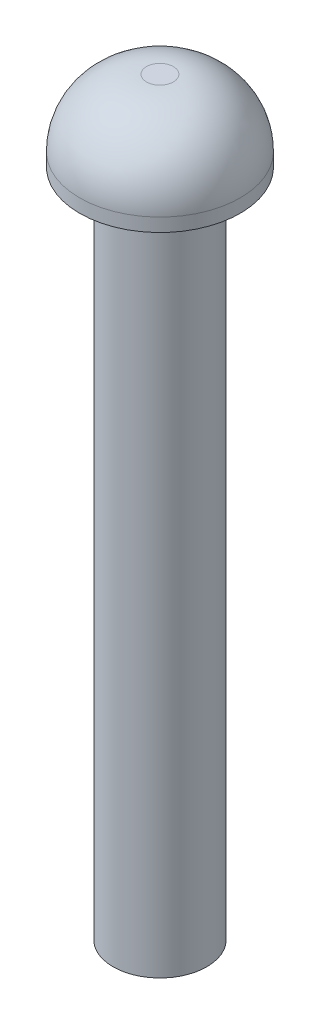
ISO-10303-21;
HEADER;
FILE_DESCRIPTION(('STEP AP214'),'2;1');
FILE_NAME('part.step','',(''),(''),'','','');
FILE_SCHEMA(('AUTOMOTIVE_DESIGN { 1 0 10303 214 1 1 1 1 }'));
ENDSEC;
DATA;
#1=APPLICATION_CONTEXT('core data for automotive mechanical design processes');
#2=APPLICATION_PROTOCOL_DEFINITION('international standard','automotive_design',2000,#1);
#3=PRODUCT_CONTEXT('',#1,'mechanical');
#4=PRODUCT('Part','Part','',(#3));
#5=PRODUCT_RELATED_PRODUCT_CATEGORY('part','',(#4));
#6=PRODUCT_DEFINITION_FORMATION('','',#4);
#7=PRODUCT_DEFINITION_CONTEXT('part definition',#1,'design');
#8=PRODUCT_DEFINITION('design','',#6,#7);
#9=PRODUCT_DEFINITION_SHAPE('','',#8);
#10=(LENGTH_UNIT() NAMED_UNIT(*) SI_UNIT(.MILLI.,.METRE.));
#11=(NAMED_UNIT(*) PLANE_ANGLE_UNIT() SI_UNIT($,.RADIAN.));
#12=(NAMED_UNIT(*) SI_UNIT($,.STERADIAN.) SOLID_ANGLE_UNIT());
#13=UNCERTAINTY_MEASURE_WITH_UNIT(LENGTH_MEASURE(1.E-05),#10,'distance_accuracy_value','');
#14=(GEOMETRIC_REPRESENTATION_CONTEXT(3) GLOBAL_UNCERTAINTY_ASSIGNED_CONTEXT((#13)) GLOBAL_UNIT_ASSIGNED_CONTEXT((#10,
#11,#12)) REPRESENTATION_CONTEXT('',''));
#15=CARTESIAN_POINT('',(0.,0.,0.));
#16=DIRECTION('',(0.,0.,1.));
#17=DIRECTION('',(1.,0.,0.));
#18=AXIS2_PLACEMENT_3D('',#15,#16,#17);
#19=CARTESIAN_POINT('',(0.,25.,0.));
#20=DIRECTION('',(0.,-1.,0.));
#21=DIRECTION('',(0.,0.,-1.));
#22=AXIS2_PLACEMENT_3D('',#19,#20,#21);
#23=CYLINDRICAL_SURFACE('',#22,1.75);
#24=CARTESIAN_POINT('',(0.,25.,0.));
#25=DIRECTION('',(0.,1.,0.));
#26=DIRECTION('',(0.,0.,1.));
#27=AXIS2_PLACEMENT_3D('',#24,#25,#26);
#28=CIRCLE('',#27,1.75);
#29=CARTESIAN_POINT('',(0.,25.,1.75));
#30=VERTEX_POINT('',#29);
#31=EDGE_CURVE('E50',#30,#30,#28,.T.);
#32=ORIENTED_EDGE('',*,*,#31,.F.);
#33=EDGE_LOOP('',(#32));
#34=FACE_BOUND('',#33,.T.);
#35=CARTESIAN_POINT('',(0.,0.,0.));
#36=DIRECTION('',(0.,1.,0.));
#37=DIRECTION('',(0.,0.,1.));
#38=AXIS2_PLACEMENT_3D('',#35,#36,#37);
#39=CIRCLE('',#38,1.75);
#40=CARTESIAN_POINT('',(0.,0.,1.75));
#41=VERTEX_POINT('',#40);
#42=EDGE_CURVE('E55',#41,#41,#39,.T.);
#43=ORIENTED_EDGE('',*,*,#42,.T.);
#44=EDGE_LOOP('',(#43));
#45=FACE_BOUND('',#44,.T.);
#46=ADVANCED_FACE('F37',(#34,#45),#23,.T.);
#47=CARTESIAN_POINT('',(0.,0.,0.));
#48=DIRECTION('',(0.,1.,0.));
#49=DIRECTION('',(0.,0.,1.));
#50=AXIS2_PLACEMENT_3D('',#47,#48,#49);
#51=PLANE('',#50);
#52=ORIENTED_EDGE('',*,*,#42,.F.);
#53=EDGE_LOOP('',(#52));
#54=FACE_BOUND('',#53,.T.);
#55=ADVANCED_FACE('F81',(#54),#51,.F.);
#56=CARTESIAN_POINT('',(0.,28.,0.));
#57=DIRECTION('',(0.,-1.,0.));
#58=DIRECTION('',(0.,0.,-1.));
#59=AXIS2_PLACEMENT_3D('',#56,#57,#58);
#60=CYLINDRICAL_SURFACE('',#59,3.);
#61=CARTESIAN_POINT('',(0.,25.5,0.));
#62=DIRECTION('',(0.,1.,0.));
#63=DIRECTION('',(0.,0.,1.));
#64=AXIS2_PLACEMENT_3D('',#61,#62,#63);
#65=CIRCLE('',#64,3.);
#66=CARTESIAN_POINT('',(0.,25.5,3.));
#67=VERTEX_POINT('',#66);
#68=EDGE_CURVE('E10',#67,#67,#65,.F.);
#69=ORIENTED_EDGE('',*,*,#68,.T.);
#70=EDGE_LOOP('',(#69));
#71=FACE_BOUND('',#70,.T.);
#72=CARTESIAN_POINT('',(0.,25.,0.));
#73=DIRECTION('',(0.,1.,0.));
#74=DIRECTION('',(0.,0.,1.));
#75=AXIS2_PLACEMENT_3D('',#72,#73,#74);
#76=CIRCLE('',#75,3.);
#77=CARTESIAN_POINT('',(0.,25.,3.));
#78=VERTEX_POINT('',#77);
#79=EDGE_CURVE('E60',#78,#78,#76,.T.);
#80=ORIENTED_EDGE('',*,*,#79,.T.);
#81=EDGE_LOOP('',(#80));
#82=FACE_BOUND('',#81,.T.);
#83=ADVANCED_FACE('F66',(#71,#82),#60,.T.);
#84=CARTESIAN_POINT('',(0.,28.,0.));
#85=DIRECTION('',(0.,1.,0.));
#86=DIRECTION('',(0.,0.,1.));
#87=AXIS2_PLACEMENT_3D('',#84,#85,#86);
#88=PLANE('',#87);
#89=CARTESIAN_POINT('',(0.,28.,0.));
#90=DIRECTION('',(0.,1.,0.));
#91=DIRECTION('',(0.,0.,1.));
#92=AXIS2_PLACEMENT_3D('',#89,#90,#91);
#93=CIRCLE('',#92,0.5);
#94=CARTESIAN_POINT('',(0.,28.,0.5));
#95=VERTEX_POINT('',#94);
#96=EDGE_CURVE('E45',#95,#95,#93,.T.);
#97=ORIENTED_EDGE('',*,*,#96,.T.);
#98=EDGE_LOOP('',(#97));
#99=FACE_BOUND('',#98,.T.);
#100=ADVANCED_FACE('F70',(#99),#88,.T.);
#101=CARTESIAN_POINT('',(0.,25.,0.));
#102=DIRECTION('',(0.,1.,0.));
#103=DIRECTION('',(0.,0.,1.));
#104=AXIS2_PLACEMENT_3D('',#101,#102,#103);
#105=PLANE('',#104);
#106=ORIENTED_EDGE('',*,*,#31,.T.);
#107=EDGE_LOOP('',(#106));
#108=FACE_BOUND('',#107,.T.);
#109=ORIENTED_EDGE('',*,*,#79,.F.);
#110=EDGE_LOOP('',(#109));
#111=FACE_BOUND('',#110,.T.);
#112=ADVANCED_FACE('F68',(#108,#111),#105,.F.);
#113=CARTESIAN_POINT('',(0.,25.5,0.));
#114=DIRECTION('',(0.,1.,0.));
#115=DIRECTION('',(0.,0.,1.));
#116=AXIS2_PLACEMENT_3D('',#113,#114,#115);
#117=DEGENERATE_TOROIDAL_SURFACE('',#116,0.5,2.5,.T.);
#118=ORIENTED_EDGE('',*,*,#68,.F.);
#119=EDGE_LOOP('',(#118));
#120=FACE_BOUND('',#119,.T.);
#121=ORIENTED_EDGE('',*,*,#96,.F.);
#122=EDGE_LOOP('',(#121));
#123=FACE_BOUND('',#122,.T.);
#124=ADVANCED_FACE('F39',(#120,#123),#117,.T.);
#125=CLOSED_SHELL('',(#46,#55,#83,#100,#112,#124));
#126=MANIFOLD_SOLID_BREP('B2',#125);
#127=ADVANCED_BREP_SHAPE_REPRESENTATION('',(#18,#126),#14);
#128=SHAPE_DEFINITION_REPRESENTATION(#9,#127);
ENDSEC;
END-ISO-10303-21;
